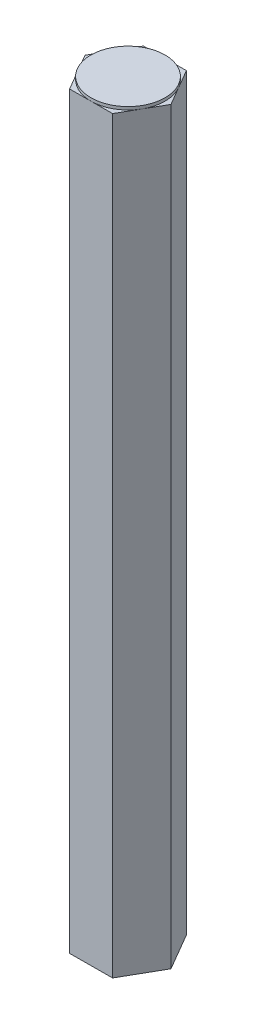
ISO-10303-21;
HEADER;
FILE_DESCRIPTION(('STEP AP214'),'2;1');
FILE_NAME('part.step','',(''),(''),'','','');
FILE_SCHEMA(('AUTOMOTIVE_DESIGN { 1 0 10303 214 1 1 1 1 }'));
ENDSEC;
DATA;
#1=APPLICATION_CONTEXT('core data for automotive mechanical design processes');
#2=APPLICATION_PROTOCOL_DEFINITION('international standard','automotive_design',2000,#1);
#3=PRODUCT_CONTEXT('',#1,'mechanical');
#4=PRODUCT('Part','Part','',(#3));
#5=PRODUCT_RELATED_PRODUCT_CATEGORY('part','',(#4));
#6=PRODUCT_DEFINITION_FORMATION('','',#4);
#7=PRODUCT_DEFINITION_CONTEXT('part definition',#1,'design');
#8=PRODUCT_DEFINITION('design','',#6,#7);
#9=PRODUCT_DEFINITION_SHAPE('','',#8);
#10=(LENGTH_UNIT() NAMED_UNIT(*) SI_UNIT(.MILLI.,.METRE.));
#11=(NAMED_UNIT(*) PLANE_ANGLE_UNIT() SI_UNIT($,.RADIAN.));
#12=(NAMED_UNIT(*) SI_UNIT($,.STERADIAN.) SOLID_ANGLE_UNIT());
#13=UNCERTAINTY_MEASURE_WITH_UNIT(LENGTH_MEASURE(1.E-05),#10,'distance_accuracy_value','');
#14=(GEOMETRIC_REPRESENTATION_CONTEXT(3) GLOBAL_UNCERTAINTY_ASSIGNED_CONTEXT((#13)) GLOBAL_UNIT_ASSIGNED_CONTEXT((#10,
#11,#12)) REPRESENTATION_CONTEXT('',''));
#15=CARTESIAN_POINT('',(0.,0.,0.));
#16=DIRECTION('',(0.,0.,1.));
#17=DIRECTION('',(1.,0.,0.));
#18=AXIS2_PLACEMENT_3D('',#15,#16,#17);
#19=CARTESIAN_POINT('',(0.,64.135,0.));
#20=DIRECTION('',(0.,1.,0.));
#21=DIRECTION('',(0.,0.,1.));
#22=AXIS2_PLACEMENT_3D('',#19,#20,#21);
#23=PLANE('',#22);
#24=CARTESIAN_POINT('',(0.,64.135,0.));
#25=DIRECTION('',(0.,1.,0.));
#26=DIRECTION('',(0.,0.,1.));
#27=AXIS2_PLACEMENT_3D('',#24,#25,#26);
#28=CIRCLE('',#27,3.17499999999999);
#29=CARTESIAN_POINT('',(0.0126840920144765,64.135,3.17497466349099));
#30=VERTEX_POINT('',#29);
#31=CARTESIAN_POINT('',(2.75595076096238,64.135,1.57650258583702));
#32=VERTEX_POINT('',#31);
#33=EDGE_CURVE('E54',#30,#32,#28,.T.);
#34=ORIENTED_EDGE('',*,*,#33,.F.);
#35=DIRECTION('',(0.999992019997164,0.,-0.00399498961085876));
#36=VECTOR('',#35,1.);
#37=CARTESIAN_POINT('',(-1.82038838462228,64.135,3.18229782742998));
#38=LINE('',#37,#36);
#39=CARTESIAN_POINT('',(1.84575656865123,64.135,3.16765149955201));
#40=VERTEX_POINT('',#39);
#41=EDGE_CURVE('E122',#30,#40,#38,.T.);
#42=ORIENTED_EDGE('',*,*,#41,.T.);
#43=DIRECTION('',(0.496536247507724,0.,-0.868015987704689));
#44=VECTOR('',#43,1.);
#45=CARTESIAN_POINT('',(1.84575656865123,64.135,3.16765149955201));
#46=LINE('',#45,#44);
#47=EDGE_CURVE('E134',#40,#32,#46,.T.);
#48=ORIENTED_EDGE('',*,*,#47,.T.);
#49=EDGE_LOOP('',(#34,#42,#48));
#50=FACE_BOUND('',#49,.T.);
#51=ADVANCED_FACE('F43',(#50),#23,.T.);
#52=CARTESIAN_POINT('',(2.74326666894791,64.135,-1.59847207765397));
#53=VERTEX_POINT('',#52);
#54=EDGE_CURVE('E11',#32,#53,#28,.T.);
#55=ORIENTED_EDGE('',*,*,#54,.F.);
#56=CARTESIAN_POINT('',(3.66614495327353,64.135,-0.0146463278779733));
#57=VERTEX_POINT('',#56);
#58=EDGE_CURVE('E121',#32,#57,#46,.T.);
#59=ORIENTED_EDGE('',*,*,#58,.T.);
#60=DIRECTION('',(-0.503455772489441,0.,-0.864020998093831));
#61=VECTOR('',#60,1.);
#62=CARTESIAN_POINT('',(3.66614495327353,64.135,-0.0146463278779733));
#63=LINE('',#62,#61);
#64=EDGE_CURVE('E146',#57,#53,#63,.T.);
#65=ORIENTED_EDGE('',*,*,#64,.T.);
#66=EDGE_LOOP('',(#55,#59,#65));
#67=FACE_BOUND('',#66,.T.);
#68=ADVANCED_FACE('F207',(#67),#23,.T.);
#69=CARTESIAN_POINT('',(-0.0126840920144826,64.135,-3.174974663491));
#70=VERTEX_POINT('',#69);
#71=EDGE_CURVE('E52',#53,#70,#28,.T.);
#72=ORIENTED_EDGE('',*,*,#71,.F.);
#73=CARTESIAN_POINT('',(1.82038838462228,64.135,-3.18229782742999));
#74=VERTEX_POINT('',#73);
#75=EDGE_CURVE('E149',#53,#74,#63,.T.);
#76=ORIENTED_EDGE('',*,*,#75,.T.);
#77=DIRECTION('',(-0.999992019997164,0.,0.00399498961086065));
#78=VECTOR('',#77,1.);
#79=CARTESIAN_POINT('',(1.82038838462228,64.135,-3.18229782742999));
#80=LINE('',#79,#78);
#81=EDGE_CURVE('E150',#74,#70,#80,.T.);
#82=ORIENTED_EDGE('',*,*,#81,.T.);
#83=EDGE_LOOP('',(#72,#76,#82));
#84=FACE_BOUND('',#83,.T.);
#85=ADVANCED_FACE('F210',(#84),#23,.T.);
#86=CARTESIAN_POINT('',(-2.75595076096238,64.135,-1.57650258583701));
#87=VERTEX_POINT('',#86);
#88=EDGE_CURVE('E141',#70,#87,#28,.T.);
#89=ORIENTED_EDGE('',*,*,#88,.F.);
#90=CARTESIAN_POINT('',(-1.84575656865123,64.135,-3.16765149955201));
#91=VERTEX_POINT('',#90);
#92=EDGE_CURVE('E148',#70,#91,#80,.T.);
#93=ORIENTED_EDGE('',*,*,#92,.T.);
#94=DIRECTION('',(-0.496536247507723,0.,0.86801598770469));
#95=VECTOR('',#94,1.);
#96=CARTESIAN_POINT('',(-1.84575656865123,64.135,-3.16765149955201));
#97=LINE('',#96,#95);
#98=EDGE_CURVE('E154',#91,#87,#97,.T.);
#99=ORIENTED_EDGE('',*,*,#98,.T.);
#100=EDGE_LOOP('',(#89,#93,#99));
#101=FACE_BOUND('',#100,.T.);
#102=ADVANCED_FACE('F214',(#101),#23,.T.);
#103=CARTESIAN_POINT('',(-2.7432666689479,64.135,1.59847207765397));
#104=VERTEX_POINT('',#103);
#105=EDGE_CURVE('E140',#87,#104,#28,.T.);
#106=ORIENTED_EDGE('',*,*,#105,.F.);
#107=CARTESIAN_POINT('',(-3.66614495327352,64.135,0.0146463278779713));
#108=VERTEX_POINT('',#107);
#109=EDGE_CURVE('E153',#87,#108,#97,.T.);
#110=ORIENTED_EDGE('',*,*,#109,.T.);
#111=DIRECTION('',(0.503455772489441,0.,0.864020998093831));
#112=VECTOR('',#111,1.);
#113=CARTESIAN_POINT('',(-3.66614495327352,64.135,0.0146463278779713));
#114=LINE('',#113,#112);
#115=EDGE_CURVE('E132',#108,#104,#114,.T.);
#116=ORIENTED_EDGE('',*,*,#115,.T.);
#117=EDGE_LOOP('',(#106,#110,#116));
#118=FACE_BOUND('',#117,.T.);
#119=ADVANCED_FACE('F216',(#118),#23,.T.);
#120=CARTESIAN_POINT('',(3.66614495327353,64.135,-0.0146463278779733));
#121=DIRECTION('',(-0.864020998093831,0.,0.503455772489441));
#122=DIRECTION('',(0.503455772489441,0.,0.864020998093831));
#123=AXIS2_PLACEMENT_3D('',#120,#121,#122);
#124=PLANE('',#123);
#125=DIRECTION('',(-0.503455772489441,0.,-0.864020998093831));
#126=VECTOR('',#125,1.);
#127=CARTESIAN_POINT('',(3.66614495327353,0.,-0.0146463278779733));
#128=LINE('',#127,#126);
#129=CARTESIAN_POINT('',(3.66614495327353,0.,-0.0146463278779733));
#130=VERTEX_POINT('',#129);
#131=CARTESIAN_POINT('',(1.82038838462228,0.,-3.18229782742999));
#132=VERTEX_POINT('',#131);
#133=EDGE_CURVE('E161',#130,#132,#128,.T.);
#134=ORIENTED_EDGE('',*,*,#133,.T.);
#135=DIRECTION('',(0.,-1.,0.));
#136=VECTOR('',#135,1.);
#137=CARTESIAN_POINT('',(1.82038838462228,64.135,-3.18229782742999));
#138=LINE('',#137,#136);
#139=EDGE_CURVE('E47',#74,#132,#138,.T.);
#140=ORIENTED_EDGE('',*,*,#139,.F.);
#141=ORIENTED_EDGE('',*,*,#75,.F.);
#142=ORIENTED_EDGE('',*,*,#64,.F.);
#143=DIRECTION('',(0.,-1.,0.));
#144=VECTOR('',#143,1.);
#145=CARTESIAN_POINT('',(3.66614495327353,64.135,-0.0146463278779733));
#146=LINE('',#145,#144);
#147=EDGE_CURVE('E160',#57,#130,#146,.T.);
#148=ORIENTED_EDGE('',*,*,#147,.T.);
#149=EDGE_LOOP('',(#134,#140,#141,#142,#148));
#150=FACE_BOUND('',#149,.T.);
#151=ADVANCED_FACE('F45',(#150),#124,.F.);
#152=CARTESIAN_POINT('',(1.82038838462228,64.135,-3.18229782742999));
#153=DIRECTION('',(0.00399498961086065,0.,0.999992019997164));
#154=DIRECTION('',(0.999992019997164,0.,-0.00399498961086065));
#155=AXIS2_PLACEMENT_3D('',#152,#153,#154);
#156=PLANE('',#155);
#157=DIRECTION('',(-0.999992019997164,0.,0.00399498961086065));
#158=VECTOR('',#157,1.);
#159=CARTESIAN_POINT('',(1.82038838462228,0.,-3.18229782742999));
#160=LINE('',#159,#158);
#161=CARTESIAN_POINT('',(-1.84575656865123,0.,-3.16765149955201));
#162=VERTEX_POINT('',#161);
#163=EDGE_CURVE('E164',#132,#162,#160,.T.);
#164=ORIENTED_EDGE('',*,*,#163,.T.);
#165=DIRECTION('',(0.,-1.,0.));
#166=VECTOR('',#165,1.);
#167=CARTESIAN_POINT('',(-1.84575656865123,64.135,-3.16765149955201));
#168=LINE('',#167,#166);
#169=EDGE_CURVE('E143',#91,#162,#168,.T.);
#170=ORIENTED_EDGE('',*,*,#169,.F.);
#171=ORIENTED_EDGE('',*,*,#92,.F.);
#172=ORIENTED_EDGE('',*,*,#81,.F.);
#173=ORIENTED_EDGE('',*,*,#139,.T.);
#174=EDGE_LOOP('',(#164,#170,#171,#172,#173));
#175=FACE_BOUND('',#174,.T.);
#176=ADVANCED_FACE('F212',(#175),#156,.F.);
#177=CARTESIAN_POINT('',(-1.84575656865123,64.135,-3.16765149955201));
#178=DIRECTION('',(0.868015987704691,0.,0.496536247507723));
#179=DIRECTION('',(0.496536247507723,0.,-0.868015987704691));
#180=AXIS2_PLACEMENT_3D('',#177,#178,#179);
#181=PLANE('',#180);
#182=DIRECTION('',(-0.496536247507723,0.,0.86801598770469));
#183=VECTOR('',#182,1.);
#184=CARTESIAN_POINT('',(-1.84575656865123,0.,-3.16765149955201));
#185=LINE('',#184,#183);
#186=CARTESIAN_POINT('',(-3.66614495327352,0.,0.0146463278779713));
#187=VERTEX_POINT('',#186);
#188=EDGE_CURVE('E166',#162,#187,#185,.T.);
#189=ORIENTED_EDGE('',*,*,#188,.T.);
#190=DIRECTION('',(0.,-1.,0.));
#191=VECTOR('',#190,1.);
#192=CARTESIAN_POINT('',(-3.66614495327352,64.135,0.0146463278779713));
#193=LINE('',#192,#191);
#194=EDGE_CURVE('E179',#108,#187,#193,.T.);
#195=ORIENTED_EDGE('',*,*,#194,.F.);
#196=ORIENTED_EDGE('',*,*,#109,.F.);
#197=ORIENTED_EDGE('',*,*,#98,.F.);
#198=ORIENTED_EDGE('',*,*,#169,.T.);
#199=EDGE_LOOP('',(#189,#195,#196,#197,#198));
#200=FACE_BOUND('',#199,.T.);
#201=ADVANCED_FACE('F186',(#200),#181,.F.);
#202=CARTESIAN_POINT('',(-3.66614495327352,64.135,0.0146463278779713));
#203=DIRECTION('',(0.864020998093831,0.,-0.503455772489441));
#204=DIRECTION('',(-0.503455772489441,0.,-0.864020998093832));
#205=AXIS2_PLACEMENT_3D('',#202,#203,#204);
#206=PLANE('',#205);
#207=DIRECTION('',(0.503455772489441,0.,0.864020998093831));
#208=VECTOR('',#207,1.);
#209=CARTESIAN_POINT('',(-3.66614495327352,0.,0.0146463278779713));
#210=LINE('',#209,#208);
#211=CARTESIAN_POINT('',(-1.82038838462228,0.,3.18229782742998));
#212=VERTEX_POINT('',#211);
#213=EDGE_CURVE('E168',#187,#212,#210,.T.);
#214=ORIENTED_EDGE('',*,*,#213,.T.);
#215=DIRECTION('',(0.,-1.,0.));
#216=VECTOR('',#215,1.);
#217=CARTESIAN_POINT('',(-1.82038838462228,64.135,3.18229782742998));
#218=LINE('',#217,#216);
#219=CARTESIAN_POINT('',(-1.82038838462228,64.135,3.18229782742998));
#220=VERTEX_POINT('',#219);
#221=EDGE_CURVE('E177',#220,#212,#218,.T.);
#222=ORIENTED_EDGE('',*,*,#221,.F.);
#223=EDGE_CURVE('E117',#104,#220,#114,.T.);
#224=ORIENTED_EDGE('',*,*,#223,.F.);
#225=ORIENTED_EDGE('',*,*,#115,.F.);
#226=ORIENTED_EDGE('',*,*,#194,.T.);
#227=EDGE_LOOP('',(#214,#222,#224,#225,#226));
#228=FACE_BOUND('',#227,.T.);
#229=ADVANCED_FACE('F198',(#228),#206,.F.);
#230=CARTESIAN_POINT('',(-1.82038838462228,64.135,3.18229782742998));
#231=DIRECTION('',(-0.00399498961085876,0.,-0.999992019997164));
#232=DIRECTION('',(-0.999992019997164,0.,0.00399498961085876));
#233=AXIS2_PLACEMENT_3D('',#230,#231,#232);
#234=PLANE('',#233);
#235=DIRECTION('',(0.999992019997164,0.,-0.00399498961085876));
#236=VECTOR('',#235,1.);
#237=CARTESIAN_POINT('',(-1.82038838462228,0.,3.18229782742998));
#238=LINE('',#237,#236);
#239=CARTESIAN_POINT('',(1.84575656865123,0.,3.16765149955201));
#240=VERTEX_POINT('',#239);
#241=EDGE_CURVE('E170',#212,#240,#238,.T.);
#242=ORIENTED_EDGE('',*,*,#241,.T.);
#243=DIRECTION('',(0.,-1.,0.));
#244=VECTOR('',#243,1.);
#245=CARTESIAN_POINT('',(1.84575656865123,64.135,3.16765149955201));
#246=LINE('',#245,#244);
#247=EDGE_CURVE('E128',#40,#240,#246,.T.);
#248=ORIENTED_EDGE('',*,*,#247,.F.);
#249=ORIENTED_EDGE('',*,*,#41,.F.);
#250=EDGE_CURVE('E114',#220,#30,#38,.T.);
#251=ORIENTED_EDGE('',*,*,#250,.F.);
#252=ORIENTED_EDGE('',*,*,#221,.T.);
#253=EDGE_LOOP('',(#242,#248,#249,#251,#252));
#254=FACE_BOUND('',#253,.T.);
#255=ADVANCED_FACE('F126',(#254),#234,.F.);
#256=CARTESIAN_POINT('',(1.84575656865123,64.135,3.16765149955201));
#257=DIRECTION('',(-0.86801598770469,0.,-0.496536247507724));
#258=DIRECTION('',(-0.496536247507724,0.,0.86801598770469));
#259=AXIS2_PLACEMENT_3D('',#256,#257,#258);
#260=PLANE('',#259);
#261=DIRECTION('',(0.496536247507724,0.,-0.868015987704689));
#262=VECTOR('',#261,1.);
#263=CARTESIAN_POINT('',(1.84575656865123,0.,3.16765149955201));
#264=LINE('',#263,#262);
#265=EDGE_CURVE('E172',#240,#130,#264,.T.);
#266=ORIENTED_EDGE('',*,*,#265,.T.);
#267=ORIENTED_EDGE('',*,*,#147,.F.);
#268=ORIENTED_EDGE('',*,*,#58,.F.);
#269=ORIENTED_EDGE('',*,*,#47,.F.);
#270=ORIENTED_EDGE('',*,*,#247,.T.);
#271=EDGE_LOOP('',(#266,#267,#268,#269,#270));
#272=FACE_BOUND('',#271,.T.);
#273=ADVANCED_FACE('F201',(#272),#260,.F.);
#274=EDGE_CURVE('E67',#104,#30,#28,.T.);
#275=ORIENTED_EDGE('',*,*,#274,.F.);
#276=ORIENTED_EDGE('',*,*,#223,.T.);
#277=ORIENTED_EDGE('',*,*,#250,.T.);
#278=EDGE_LOOP('',(#275,#276,#277));
#279=FACE_BOUND('',#278,.T.);
#280=ADVANCED_FACE('F116',(#279),#23,.T.);
#281=CARTESIAN_POINT('',(0.,0.,0.));
#282=DIRECTION('',(0.,1.,0.));
#283=DIRECTION('',(0.,0.,1.));
#284=AXIS2_PLACEMENT_3D('',#281,#282,#283);
#285=PLANE('',#284);
#286=ORIENTED_EDGE('',*,*,#133,.F.);
#287=ORIENTED_EDGE('',*,*,#265,.F.);
#288=ORIENTED_EDGE('',*,*,#241,.F.);
#289=ORIENTED_EDGE('',*,*,#213,.F.);
#290=ORIENTED_EDGE('',*,*,#188,.F.);
#291=ORIENTED_EDGE('',*,*,#163,.F.);
#292=EDGE_LOOP('',(#286,#287,#288,#289,#290,#291));
#293=FACE_BOUND('',#292,.T.);
#294=ADVANCED_FACE('F194',(#293),#285,.F.);
#295=CARTESIAN_POINT('',(0.,64.389,0.));
#296=DIRECTION('',(0.,-1.,0.));
#297=DIRECTION('',(0.,0.,-1.));
#298=AXIS2_PLACEMENT_3D('',#295,#296,#297);
#299=CYLINDRICAL_SURFACE('',#298,3.17499999999999);
#300=CARTESIAN_POINT('',(0.,64.389,0.));
#301=DIRECTION('',(0.,1.,0.));
#302=DIRECTION('',(0.,0.,1.));
#303=AXIS2_PLACEMENT_3D('',#300,#301,#302);
#304=CIRCLE('',#303,3.17499999999999);
#305=CARTESIAN_POINT('',(0.,64.389,3.17499999999999));
#306=VERTEX_POINT('',#305);
#307=EDGE_CURVE('E136',#306,#306,#304,.T.);
#308=ORIENTED_EDGE('',*,*,#307,.F.);
#309=EDGE_LOOP('',(#308));
#310=FACE_BOUND('',#309,.T.);
#311=ORIENTED_EDGE('',*,*,#33,.T.);
#312=ORIENTED_EDGE('',*,*,#54,.T.);
#313=ORIENTED_EDGE('',*,*,#71,.T.);
#314=ORIENTED_EDGE('',*,*,#88,.T.);
#315=ORIENTED_EDGE('',*,*,#105,.T.);
#316=ORIENTED_EDGE('',*,*,#274,.T.);
#317=EDGE_LOOP('',(#311,#312,#313,#314,#315,#316));
#318=FACE_BOUND('',#317,.T.);
#319=ADVANCED_FACE('F138',(#310,#318),#299,.T.);
#320=CARTESIAN_POINT('',(0.,64.389,0.));
#321=DIRECTION('',(0.,1.,0.));
#322=DIRECTION('',(0.,0.,1.));
#323=AXIS2_PLACEMENT_3D('',#320,#321,#322);
#324=PLANE('',#323);
#325=ORIENTED_EDGE('',*,*,#307,.T.);
#326=EDGE_LOOP('',(#325));
#327=FACE_BOUND('',#326,.T.);
#328=ADVANCED_FACE('F286',(#327),#324,.T.);
#329=CLOSED_SHELL('',(#51,#68,#85,#102,#119,#151,#176,#201,#229,#255,#273,#280,#294,#319,#328));
#330=MANIFOLD_SOLID_BREP('B2',#329);
#331=ADVANCED_BREP_SHAPE_REPRESENTATION('',(#18,#330),#14);
#332=SHAPE_DEFINITION_REPRESENTATION(#9,#331);
ENDSEC;
END-ISO-10303-21;
